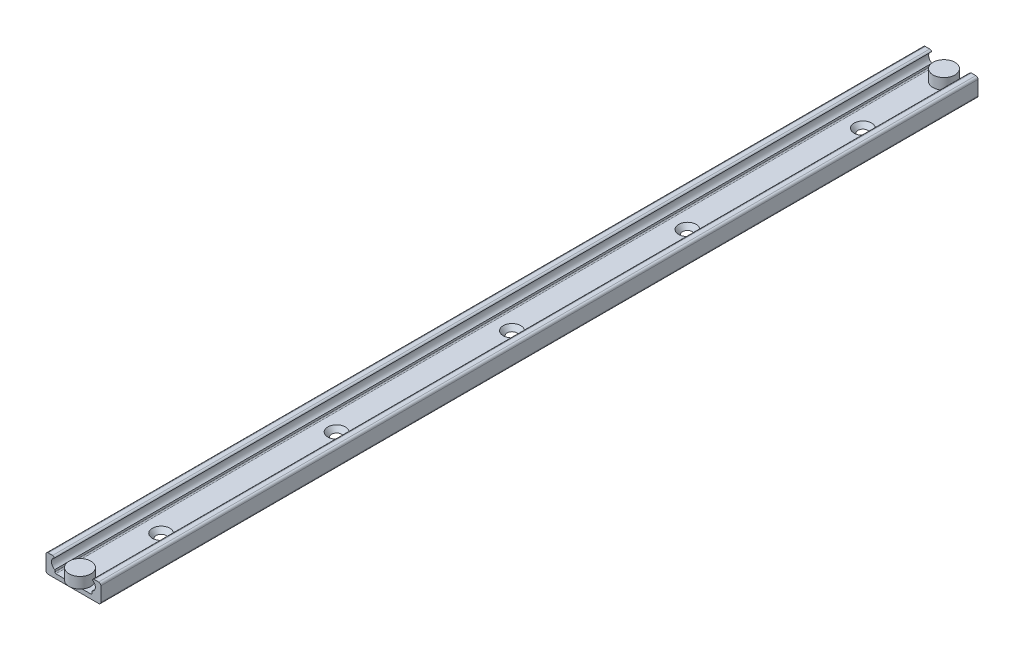
ISO-10303-21;
HEADER;
FILE_DESCRIPTION(('STEP AP214'),'2;1');
FILE_NAME('part.step','',(''),(''),'','','');
FILE_SCHEMA(('AUTOMOTIVE_DESIGN { 1 0 10303 214 1 1 1 1 }'));
ENDSEC;
DATA;
#1=APPLICATION_CONTEXT('core data for automotive mechanical design processes');
#2=APPLICATION_PROTOCOL_DEFINITION('international standard','automotive_design',2000,#1);
#3=PRODUCT_CONTEXT('',#1,'mechanical');
#4=PRODUCT('Part','Part','',(#3));
#5=PRODUCT_RELATED_PRODUCT_CATEGORY('part','',(#4));
#6=PRODUCT_DEFINITION_FORMATION('','',#4);
#7=PRODUCT_DEFINITION_CONTEXT('part definition',#1,'design');
#8=PRODUCT_DEFINITION('design','',#6,#7);
#9=PRODUCT_DEFINITION_SHAPE('','',#8);
#10=(LENGTH_UNIT() NAMED_UNIT(*) SI_UNIT(.MILLI.,.METRE.));
#11=(NAMED_UNIT(*) PLANE_ANGLE_UNIT() SI_UNIT($,.RADIAN.));
#12=(NAMED_UNIT(*) SI_UNIT($,.STERADIAN.) SOLID_ANGLE_UNIT());
#13=UNCERTAINTY_MEASURE_WITH_UNIT(LENGTH_MEASURE(1.E-05),#10,'distance_accuracy_value','');
#14=(GEOMETRIC_REPRESENTATION_CONTEXT(3) GLOBAL_UNCERTAINTY_ASSIGNED_CONTEXT((#13)) GLOBAL_UNIT_ASSIGNED_CONTEXT((#10,
#11,#12)) REPRESENTATION_CONTEXT('',''));
#15=CARTESIAN_POINT('',(0.,0.,0.));
#16=DIRECTION('',(0.,0.,1.));
#17=DIRECTION('',(1.,0.,0.));
#18=AXIS2_PLACEMENT_3D('',#15,#16,#17);
#19=CARTESIAN_POINT('',(-11.5000000000008,0.999999999999226,400.));
#20=DIRECTION('',(0.,0.,-1.));
#21=DIRECTION('',(-1.,0.,0.));
#22=AXIS2_PLACEMENT_3D('',#19,#20,#21);
#23=CYLINDRICAL_SURFACE('',#22,0.999999999999226);
#24=CARTESIAN_POINT('',(-11.5000000000008,0.999999999999226,0.));
#25=DIRECTION('',(0.,0.,1.));
#26=DIRECTION('',(1.,0.,0.));
#27=AXIS2_PLACEMENT_3D('',#24,#25,#26);
#28=CIRCLE('',#27,0.999999999999226);
#29=CARTESIAN_POINT('',(-12.5,1.,0.));
#30=VERTEX_POINT('',#29);
#31=CARTESIAN_POINT('',(-11.5,0.,0.));
#32=VERTEX_POINT('',#31);
#33=EDGE_CURVE('E220',#30,#32,#28,.T.);
#34=ORIENTED_EDGE('',*,*,#33,.T.);
#35=DIRECTION('',(0.,0.,-1.));
#36=VECTOR('',#35,1.);
#37=CARTESIAN_POINT('',(-11.5,0.,400.));
#38=LINE('',#37,#36);
#39=CARTESIAN_POINT('',(-11.5,0.,400.));
#40=VERTEX_POINT('',#39);
#41=EDGE_CURVE('E11',#40,#32,#38,.T.);
#42=ORIENTED_EDGE('',*,*,#41,.F.);
#43=CARTESIAN_POINT('',(-11.5000000000008,0.999999999999226,400.));
#44=DIRECTION('',(0.,0.,1.));
#45=DIRECTION('',(1.,0.,0.));
#46=AXIS2_PLACEMENT_3D('',#43,#44,#45);
#47=CIRCLE('',#46,0.999999999999226);
#48=CARTESIAN_POINT('',(-12.5,1.,400.));
#49=VERTEX_POINT('',#48);
#50=EDGE_CURVE('E214',#49,#40,#47,.T.);
#51=ORIENTED_EDGE('',*,*,#50,.F.);
#52=DIRECTION('',(0.,0.,-1.));
#53=VECTOR('',#52,1.);
#54=CARTESIAN_POINT('',(-12.5,1.,400.));
#55=LINE('',#54,#53);
#56=EDGE_CURVE('E285',#49,#30,#55,.T.);
#57=ORIENTED_EDGE('',*,*,#56,.T.);
#58=EDGE_LOOP('',(#34,#42,#51,#57));
#59=FACE_BOUND('',#58,.T.);
#60=ADVANCED_FACE('F33',(#59),#23,.T.);
#61=CARTESIAN_POINT('',(-11.5,0.,400.));
#62=DIRECTION('',(0.,1.,0.));
#63=DIRECTION('',(0.,0.,1.));
#64=AXIS2_PLACEMENT_3D('',#61,#62,#63);
#65=PLANE('',#64);
#66=CARTESIAN_POINT('',(0.,0.,360.));
#67=DIRECTION('',(0.,1.,0.));
#68=DIRECTION('',(0.,0.,1.));
#69=AXIS2_PLACEMENT_3D('',#66,#67,#68);
#70=CIRCLE('',#69,2.25);
#71=CARTESIAN_POINT('',(0.,0.,362.25));
#72=VERTEX_POINT('',#71);
#73=EDGE_CURVE('E245',#72,#72,#70,.T.);
#74=ORIENTED_EDGE('',*,*,#73,.T.);
#75=EDGE_LOOP('',(#74));
#76=FACE_BOUND('',#75,.T.);
#77=CARTESIAN_POINT('',(0.,0.,280.));
#78=DIRECTION('',(0.,1.,0.));
#79=DIRECTION('',(0.,0.,1.));
#80=AXIS2_PLACEMENT_3D('',#77,#78,#79);
#81=CIRCLE('',#80,2.25);
#82=CARTESIAN_POINT('',(0.,0.,282.25));
#83=VERTEX_POINT('',#82);
#84=EDGE_CURVE('E239',#83,#83,#81,.T.);
#85=ORIENTED_EDGE('',*,*,#84,.T.);
#86=EDGE_LOOP('',(#85));
#87=FACE_BOUND('',#86,.T.);
#88=CARTESIAN_POINT('',(0.,0.,200.));
#89=DIRECTION('',(0.,1.,0.));
#90=DIRECTION('',(0.,0.,1.));
#91=AXIS2_PLACEMENT_3D('',#88,#89,#90);
#92=CIRCLE('',#91,2.25);
#93=CARTESIAN_POINT('',(0.,0.,202.25));
#94=VERTEX_POINT('',#93);
#95=EDGE_CURVE('E233',#94,#94,#92,.T.);
#96=ORIENTED_EDGE('',*,*,#95,.T.);
#97=EDGE_LOOP('',(#96));
#98=FACE_BOUND('',#97,.T.);
#99=CARTESIAN_POINT('',(0.,0.,120.));
#100=DIRECTION('',(0.,1.,0.));
#101=DIRECTION('',(0.,0.,1.));
#102=AXIS2_PLACEMENT_3D('',#99,#100,#101);
#103=CIRCLE('',#102,2.25);
#104=CARTESIAN_POINT('',(0.,0.,122.25));
#105=VERTEX_POINT('',#104);
#106=EDGE_CURVE('E227',#105,#105,#103,.T.);
#107=ORIENTED_EDGE('',*,*,#106,.T.);
#108=EDGE_LOOP('',(#107));
#109=FACE_BOUND('',#108,.T.);
#110=CARTESIAN_POINT('',(0.,0.,40.));
#111=DIRECTION('',(0.,1.,0.));
#112=DIRECTION('',(0.,0.,1.));
#113=AXIS2_PLACEMENT_3D('',#110,#111,#112);
#114=CIRCLE('',#113,2.25);
#115=CARTESIAN_POINT('',(0.,0.,42.25));
#116=VERTEX_POINT('',#115);
#117=EDGE_CURVE('E221',#116,#116,#114,.T.);
#118=ORIENTED_EDGE('',*,*,#117,.T.);
#119=EDGE_LOOP('',(#118));
#120=FACE_BOUND('',#119,.T.);
#121=DIRECTION('',(1.,0.,0.));
#122=VECTOR('',#121,1.);
#123=CARTESIAN_POINT('',(-11.5,0.,0.));
#124=LINE('',#123,#122);
#125=CARTESIAN_POINT('',(11.5,0.,0.));
#126=VERTEX_POINT('',#125);
#127=EDGE_CURVE('E344',#32,#126,#124,.T.);
#128=ORIENTED_EDGE('',*,*,#127,.T.);
#129=DIRECTION('',(0.,0.,-1.));
#130=VECTOR('',#129,1.);
#131=CARTESIAN_POINT('',(11.5,0.,400.));
#132=LINE('',#131,#130);
#133=CARTESIAN_POINT('',(11.5,0.,400.));
#134=VERTEX_POINT('',#133);
#135=EDGE_CURVE('E40',#134,#126,#132,.T.);
#136=ORIENTED_EDGE('',*,*,#135,.F.);
#137=DIRECTION('',(1.,0.,0.));
#138=VECTOR('',#137,1.);
#139=CARTESIAN_POINT('',(-11.5,0.,400.));
#140=LINE('',#139,#138);
#141=EDGE_CURVE('E212',#40,#134,#140,.T.);
#142=ORIENTED_EDGE('',*,*,#141,.F.);
#143=ORIENTED_EDGE('',*,*,#41,.T.);
#144=EDGE_LOOP('',(#128,#136,#142,#143));
#145=FACE_BOUND('',#144,.T.);
#146=ADVANCED_FACE('F393',(#76,#87,#98,#109,#120,#145),#65,.F.);
#147=CARTESIAN_POINT('',(11.5000000000008,0.999999999999226,400.));
#148=DIRECTION('',(0.,0.,-1.));
#149=DIRECTION('',(-1.,0.,0.));
#150=AXIS2_PLACEMENT_3D('',#147,#148,#149);
#151=CYLINDRICAL_SURFACE('',#150,0.999999999999226);
#152=CARTESIAN_POINT('',(11.5000000000008,0.999999999999226,0.));
#153=DIRECTION('',(0.,0.,1.));
#154=DIRECTION('',(1.,0.,0.));
#155=AXIS2_PLACEMENT_3D('',#152,#153,#154);
#156=CIRCLE('',#155,0.999999999999226);
#157=CARTESIAN_POINT('',(12.5,1.,0.));
#158=VERTEX_POINT('',#157);
#159=EDGE_CURVE('E339',#126,#158,#156,.T.);
#160=ORIENTED_EDGE('',*,*,#159,.T.);
#161=DIRECTION('',(0.,0.,-1.));
#162=VECTOR('',#161,1.);
#163=CARTESIAN_POINT('',(12.5,1.,400.));
#164=LINE('',#163,#162);
#165=CARTESIAN_POINT('',(12.5,1.,400.));
#166=VERTEX_POINT('',#165);
#167=EDGE_CURVE('E330',#166,#158,#164,.T.);
#168=ORIENTED_EDGE('',*,*,#167,.F.);
#169=CARTESIAN_POINT('',(11.5000000000008,0.999999999999226,400.));
#170=DIRECTION('',(0.,0.,1.));
#171=DIRECTION('',(1.,0.,0.));
#172=AXIS2_PLACEMENT_3D('',#169,#170,#171);
#173=CIRCLE('',#172,0.999999999999226);
#174=EDGE_CURVE('E210',#134,#166,#173,.T.);
#175=ORIENTED_EDGE('',*,*,#174,.F.);
#176=ORIENTED_EDGE('',*,*,#135,.T.);
#177=EDGE_LOOP('',(#160,#168,#175,#176));
#178=FACE_BOUND('',#177,.T.);
#179=ADVANCED_FACE('F337',(#178),#151,.T.);
#180=CARTESIAN_POINT('',(12.5,1.,400.));
#181=DIRECTION('',(-1.,0.,0.));
#182=DIRECTION('',(0.,0.,1.));
#183=AXIS2_PLACEMENT_3D('',#180,#181,#182);
#184=PLANE('',#183);
#185=DIRECTION('',(0.,1.,0.));
#186=VECTOR('',#185,1.);
#187=CARTESIAN_POINT('',(12.5,1.,0.));
#188=LINE('',#187,#186);
#189=CARTESIAN_POINT('',(12.5,7.5,0.));
#190=VERTEX_POINT('',#189);
#191=EDGE_CURVE('E346',#158,#190,#188,.T.);
#192=ORIENTED_EDGE('',*,*,#191,.T.);
#193=DIRECTION('',(0.,0.,-1.));
#194=VECTOR('',#193,1.);
#195=CARTESIAN_POINT('',(12.5,7.5,400.));
#196=LINE('',#195,#194);
#197=CARTESIAN_POINT('',(12.5,7.5,400.));
#198=VERTEX_POINT('',#197);
#199=EDGE_CURVE('E327',#198,#190,#196,.T.);
#200=ORIENTED_EDGE('',*,*,#199,.F.);
#201=DIRECTION('',(0.,1.,0.));
#202=VECTOR('',#201,1.);
#203=CARTESIAN_POINT('',(12.5,1.,400.));
#204=LINE('',#203,#202);
#205=EDGE_CURVE('E208',#166,#198,#204,.T.);
#206=ORIENTED_EDGE('',*,*,#205,.F.);
#207=ORIENTED_EDGE('',*,*,#167,.T.);
#208=EDGE_LOOP('',(#192,#200,#206,#207));
#209=FACE_BOUND('',#208,.T.);
#210=ADVANCED_FACE('F390',(#209),#184,.F.);
#211=CARTESIAN_POINT('',(11.5000000000007,7.50000000000069,400.));
#212=DIRECTION('',(0.,0.,-1.));
#213=DIRECTION('',(-1.,0.,0.));
#214=AXIS2_PLACEMENT_3D('',#211,#212,#213);
#215=CYLINDRICAL_SURFACE('',#214,0.999999999999313);
#216=CARTESIAN_POINT('',(11.5000000000007,7.50000000000069,0.));
#217=DIRECTION('',(0.,0.,1.));
#218=DIRECTION('',(1.,0.,0.));
#219=AXIS2_PLACEMENT_3D('',#216,#217,#218);
#220=CIRCLE('',#219,0.999999999999313);
#221=CARTESIAN_POINT('',(11.5,8.5,0.));
#222=VERTEX_POINT('',#221);
#223=EDGE_CURVE('E348',#190,#222,#220,.T.);
#224=ORIENTED_EDGE('',*,*,#223,.T.);
#225=DIRECTION('',(0.,0.,-1.));
#226=VECTOR('',#225,1.);
#227=CARTESIAN_POINT('',(11.5,8.5,400.));
#228=LINE('',#227,#226);
#229=CARTESIAN_POINT('',(11.5,8.5,400.));
#230=VERTEX_POINT('',#229);
#231=EDGE_CURVE('E324',#230,#222,#228,.T.);
#232=ORIENTED_EDGE('',*,*,#231,.F.);
#233=CARTESIAN_POINT('',(11.5000000000007,7.50000000000069,400.));
#234=DIRECTION('',(0.,0.,1.));
#235=DIRECTION('',(1.,0.,0.));
#236=AXIS2_PLACEMENT_3D('',#233,#234,#235);
#237=CIRCLE('',#236,0.999999999999313);
#238=EDGE_CURVE('E206',#198,#230,#237,.T.);
#239=ORIENTED_EDGE('',*,*,#238,.F.);
#240=ORIENTED_EDGE('',*,*,#199,.T.);
#241=EDGE_LOOP('',(#224,#232,#239,#240));
#242=FACE_BOUND('',#241,.T.);
#243=ADVANCED_FACE('F385',(#242),#215,.T.);
#244=CARTESIAN_POINT('',(11.5,8.5,400.));
#245=DIRECTION('',(0.,-1.,0.));
#246=DIRECTION('',(0.,0.,-1.));
#247=AXIS2_PLACEMENT_3D('',#244,#245,#246);
#248=PLANE('',#247);
#249=DIRECTION('',(-1.,0.,0.));
#250=VECTOR('',#249,1.);
#251=CARTESIAN_POINT('',(11.5,8.5,0.));
#252=LINE('',#251,#250);
#253=CARTESIAN_POINT('',(9.5,8.5,0.));
#254=VERTEX_POINT('',#253);
#255=EDGE_CURVE('E354',#222,#254,#252,.T.);
#256=ORIENTED_EDGE('',*,*,#255,.T.);
#257=DIRECTION('',(0.,0.,-1.));
#258=VECTOR('',#257,1.);
#259=CARTESIAN_POINT('',(9.5,8.5,400.));
#260=LINE('',#259,#258);
#261=CARTESIAN_POINT('',(9.5,8.5,400.));
#262=VERTEX_POINT('',#261);
#263=EDGE_CURVE('E321',#262,#254,#260,.T.);
#264=ORIENTED_EDGE('',*,*,#263,.F.);
#265=DIRECTION('',(-1.,0.,0.));
#266=VECTOR('',#265,1.);
#267=CARTESIAN_POINT('',(11.5,8.5,400.));
#268=LINE('',#267,#266);
#269=EDGE_CURVE('E204',#230,#262,#268,.T.);
#270=ORIENTED_EDGE('',*,*,#269,.F.);
#271=ORIENTED_EDGE('',*,*,#231,.T.);
#272=EDGE_LOOP('',(#256,#264,#270,#271));
#273=FACE_BOUND('',#272,.T.);
#274=ADVANCED_FACE('F382',(#273),#248,.F.);
#275=CARTESIAN_POINT('',(9.50000000000007,7.49999999999999,400.));
#276=DIRECTION('',(0.,0.,-1.));
#277=DIRECTION('',(-1.,0.,0.));
#278=AXIS2_PLACEMENT_3D('',#275,#276,#277);
#279=CYLINDRICAL_SURFACE('',#278,1.00000000000001);
#280=CARTESIAN_POINT('',(9.50000000000007,7.49999999999999,0.));
#281=DIRECTION('',(0.,0.,1.));
#282=DIRECTION('',(1.,0.,0.));
#283=AXIS2_PLACEMENT_3D('',#280,#281,#282);
#284=CIRCLE('',#283,1.00000000000001);
#285=CARTESIAN_POINT('',(8.6035924033162,7.943230662982,0.));
#286=VERTEX_POINT('',#285);
#287=EDGE_CURVE('E356',#254,#286,#284,.T.);
#288=ORIENTED_EDGE('',*,*,#287,.T.);
#289=DIRECTION('',(0.,0.,-1.));
#290=VECTOR('',#289,1.);
#291=CARTESIAN_POINT('',(8.6035924033162,7.943230662982,400.));
#292=LINE('',#291,#290);
#293=CARTESIAN_POINT('',(8.6035924033162,7.943230662982,400.));
#294=VERTEX_POINT('',#293);
#295=EDGE_CURVE('E318',#294,#286,#292,.T.);
#296=ORIENTED_EDGE('',*,*,#295,.F.);
#297=CARTESIAN_POINT('',(9.50000000000007,7.49999999999999,400.));
#298=DIRECTION('',(0.,0.,1.));
#299=DIRECTION('',(1.,0.,0.));
#300=AXIS2_PLACEMENT_3D('',#297,#298,#299);
#301=CIRCLE('',#300,1.00000000000001);
#302=EDGE_CURVE('E202',#262,#294,#301,.T.);
#303=ORIENTED_EDGE('',*,*,#302,.F.);
#304=ORIENTED_EDGE('',*,*,#263,.T.);
#305=EDGE_LOOP('',(#288,#296,#303,#304));
#306=FACE_BOUND('',#305,.T.);
#307=ADVANCED_FACE('F380',(#306),#279,.T.);
#308=CARTESIAN_POINT('',(7.49999999999998,5.7,400.));
#309=DIRECTION('',(0.,0.,-1.));
#310=DIRECTION('',(-1.,0.,0.));
#311=AXIS2_PLACEMENT_3D('',#308,#309,#310);
#312=CYLINDRICAL_SURFACE('',#311,2.49999999999999);
#313=CARTESIAN_POINT('',(7.49999999999998,5.7,0.));
#314=DIRECTION('',(0.,0.,-1.));
#315=DIRECTION('',(-1.,0.,0.));
#316=AXIS2_PLACEMENT_3D('',#313,#314,#315);
#317=CIRCLE('',#316,2.49999999999999);
#318=CARTESIAN_POINT('',(8.5,3.4087121525221,0.));
#319=VERTEX_POINT('',#318);
#320=EDGE_CURVE('E358',#286,#319,#317,.T.);
#321=ORIENTED_EDGE('',*,*,#320,.T.);
#322=DIRECTION('',(0.,0.,-1.));
#323=VECTOR('',#322,1.);
#324=CARTESIAN_POINT('',(8.5,3.4087121525221,400.));
#325=LINE('',#324,#323);
#326=CARTESIAN_POINT('',(8.5,3.4087121525221,400.));
#327=VERTEX_POINT('',#326);
#328=EDGE_CURVE('E315',#327,#319,#325,.T.);
#329=ORIENTED_EDGE('',*,*,#328,.F.);
#330=CARTESIAN_POINT('',(7.49999999999998,5.7,400.));
#331=DIRECTION('',(0.,0.,-1.));
#332=DIRECTION('',(-1.,0.,0.));
#333=AXIS2_PLACEMENT_3D('',#330,#331,#332);
#334=CIRCLE('',#333,2.49999999999999);
#335=EDGE_CURVE('E198',#294,#327,#334,.T.);
#336=ORIENTED_EDGE('',*,*,#335,.F.);
#337=ORIENTED_EDGE('',*,*,#295,.T.);
#338=EDGE_LOOP('',(#321,#329,#336,#337));
#339=FACE_BOUND('',#338,.T.);
#340=ADVANCED_FACE('F371',(#339),#312,.F.);
#341=CARTESIAN_POINT('',(8.5,3.4087121525221,400.));
#342=DIRECTION('',(1.,0.,0.));
#343=DIRECTION('',(0.,0.,-1.));
#344=AXIS2_PLACEMENT_3D('',#341,#342,#343);
#345=PLANE('',#344);
#346=DIRECTION('',(0.,-1.,0.));
#347=VECTOR('',#346,1.);
#348=CARTESIAN_POINT('',(8.5,3.4087121525221,0.));
#349=LINE('',#348,#347);
#350=CARTESIAN_POINT('',(8.5,2.5,0.));
#351=VERTEX_POINT('',#350);
#352=EDGE_CURVE('E359',#319,#351,#349,.T.);
#353=ORIENTED_EDGE('',*,*,#352,.T.);
#354=DIRECTION('',(0.,0.,-1.));
#355=VECTOR('',#354,1.);
#356=CARTESIAN_POINT('',(8.5,2.5,400.));
#357=LINE('',#356,#355);
#358=CARTESIAN_POINT('',(8.5,2.5,400.));
#359=VERTEX_POINT('',#358);
#360=EDGE_CURVE('E312',#359,#351,#357,.T.);
#361=ORIENTED_EDGE('',*,*,#360,.F.);
#362=DIRECTION('',(0.,-1.,0.));
#363=VECTOR('',#362,1.);
#364=CARTESIAN_POINT('',(8.5,3.4087121525221,400.));
#365=LINE('',#364,#363);
#366=EDGE_CURVE('E197',#327,#359,#365,.T.);
#367=ORIENTED_EDGE('',*,*,#366,.F.);
#368=ORIENTED_EDGE('',*,*,#328,.T.);
#369=EDGE_LOOP('',(#353,#361,#367,#368));
#370=FACE_BOUND('',#369,.T.);
#371=ADVANCED_FACE('F375',(#370),#345,.F.);
#372=CARTESIAN_POINT('',(8.00000000000009,2.49999999999991,400.));
#373=DIRECTION('',(0.,0.,-1.));
#374=DIRECTION('',(-1.,0.,0.));
#375=AXIS2_PLACEMENT_3D('',#372,#373,#374);
#376=CYLINDRICAL_SURFACE('',#375,0.49999999999991);
#377=CARTESIAN_POINT('',(8.00000000000009,2.49999999999991,0.));
#378=DIRECTION('',(0.,0.,-1.));
#379=DIRECTION('',(-1.,0.,0.));
#380=AXIS2_PLACEMENT_3D('',#377,#378,#379);
#381=CIRCLE('',#380,0.49999999999991);
#382=CARTESIAN_POINT('',(8.,2.,0.));
#383=VERTEX_POINT('',#382);
#384=EDGE_CURVE('E269',#351,#383,#381,.T.);
#385=ORIENTED_EDGE('',*,*,#384,.T.);
#386=DIRECTION('',(0.,0.,-1.));
#387=VECTOR('',#386,1.);
#388=CARTESIAN_POINT('',(8.,2.,400.));
#389=LINE('',#388,#387);
#390=CARTESIAN_POINT('',(8.,2.,400.));
#391=VERTEX_POINT('',#390);
#392=EDGE_CURVE('E310',#391,#383,#389,.T.);
#393=ORIENTED_EDGE('',*,*,#392,.F.);
#394=CARTESIAN_POINT('',(8.00000000000009,2.49999999999991,400.));
#395=DIRECTION('',(0.,0.,-1.));
#396=DIRECTION('',(-1.,0.,0.));
#397=AXIS2_PLACEMENT_3D('',#394,#395,#396);
#398=CIRCLE('',#397,0.49999999999991);
#399=EDGE_CURVE('E191',#359,#391,#398,.T.);
#400=ORIENTED_EDGE('',*,*,#399,.F.);
#401=ORIENTED_EDGE('',*,*,#360,.T.);
#402=EDGE_LOOP('',(#385,#393,#400,#401));
#403=FACE_BOUND('',#402,.T.);
#404=ADVANCED_FACE('F365',(#403),#376,.F.);
#405=CARTESIAN_POINT('',(8.,2.,400.));
#406=DIRECTION('',(0.,-1.,0.));
#407=DIRECTION('',(0.,0.,-1.));
#408=AXIS2_PLACEMENT_3D('',#405,#406,#407);
#409=PLANE('',#408);
#410=CARTESIAN_POINT('',(0.,2.,397.));
#411=DIRECTION('',(0.,1.,0.));
#412=DIRECTION('',(0.,0.,1.));
#413=AXIS2_PLACEMENT_3D('',#410,#411,#412);
#414=CIRCLE('',#413,5.);
#415=CARTESIAN_POINT('',(4.,2.,400.));
#416=VERTEX_POINT('',#415);
#417=CARTESIAN_POINT('',(-4.,2.,400.));
#418=VERTEX_POINT('',#417);
#419=EDGE_CURVE('E46',#416,#418,#414,.T.);
#420=ORIENTED_EDGE('',*,*,#419,.F.);
#421=DIRECTION('',(-1.,0.,0.));
#422=VECTOR('',#421,1.);
#423=CARTESIAN_POINT('',(8.,2.,400.));
#424=LINE('',#423,#422);
#425=EDGE_CURVE('E176',#391,#416,#424,.T.);
#426=ORIENTED_EDGE('',*,*,#425,.F.);
#427=ORIENTED_EDGE('',*,*,#392,.T.);
#428=DIRECTION('',(-1.,0.,0.));
#429=VECTOR('',#428,1.);
#430=CARTESIAN_POINT('',(8.,2.,0.));
#431=LINE('',#430,#429);
#432=CARTESIAN_POINT('',(4.,2.,0.));
#433=VERTEX_POINT('',#432);
#434=EDGE_CURVE('E265',#383,#433,#431,.T.);
#435=ORIENTED_EDGE('',*,*,#434,.T.);
#436=CARTESIAN_POINT('',(0.,2.,3.));
#437=DIRECTION('',(0.,1.,0.));
#438=DIRECTION('',(0.,0.,1.));
#439=AXIS2_PLACEMENT_3D('',#436,#437,#438);
#440=CIRCLE('',#439,5.);
#441=CARTESIAN_POINT('',(-4.,2.,0.));
#442=VERTEX_POINT('',#441);
#443=EDGE_CURVE('E252',#442,#433,#440,.T.);
#444=ORIENTED_EDGE('',*,*,#443,.F.);
#445=CARTESIAN_POINT('',(-8.,2.,0.));
#446=VERTEX_POINT('',#445);
#447=EDGE_CURVE('E266',#442,#446,#431,.T.);
#448=ORIENTED_EDGE('',*,*,#447,.T.);
#449=DIRECTION('',(0.,0.,-1.));
#450=VECTOR('',#449,1.);
#451=CARTESIAN_POINT('',(-8.,2.,400.));
#452=LINE('',#451,#450);
#453=CARTESIAN_POINT('',(-8.,2.,400.));
#454=VERTEX_POINT('',#453);
#455=EDGE_CURVE('E307',#454,#446,#452,.T.);
#456=ORIENTED_EDGE('',*,*,#455,.F.);
#457=EDGE_CURVE('E177',#418,#454,#424,.T.);
#458=ORIENTED_EDGE('',*,*,#457,.F.);
#459=EDGE_LOOP('',(#420,#426,#427,#435,#444,#448,#456,#458));
#460=FACE_BOUND('',#459,.T.);
#461=CARTESIAN_POINT('',(0.,2.,360.));
#462=DIRECTION('',(0.,1.,0.));
#463=DIRECTION('',(0.,0.,1.));
#464=AXIS2_PLACEMENT_3D('',#461,#462,#463);
#465=CIRCLE('',#464,4.);
#466=CARTESIAN_POINT('',(0.,2.,364.));
#467=VERTEX_POINT('',#466);
#468=EDGE_CURVE('E242',#467,#467,#465,.T.);
#469=ORIENTED_EDGE('',*,*,#468,.F.);
#470=EDGE_LOOP('',(#469));
#471=FACE_BOUND('',#470,.T.);
#472=CARTESIAN_POINT('',(0.,2.,280.));
#473=DIRECTION('',(0.,1.,0.));
#474=DIRECTION('',(0.,0.,1.));
#475=AXIS2_PLACEMENT_3D('',#472,#473,#474);
#476=CIRCLE('',#475,4.);
#477=CARTESIAN_POINT('',(0.,2.,284.));
#478=VERTEX_POINT('',#477);
#479=EDGE_CURVE('E236',#478,#478,#476,.T.);
#480=ORIENTED_EDGE('',*,*,#479,.F.);
#481=EDGE_LOOP('',(#480));
#482=FACE_BOUND('',#481,.T.);
#483=CARTESIAN_POINT('',(0.,2.,200.));
#484=DIRECTION('',(0.,1.,0.));
#485=DIRECTION('',(0.,0.,1.));
#486=AXIS2_PLACEMENT_3D('',#483,#484,#485);
#487=CIRCLE('',#486,4.);
#488=CARTESIAN_POINT('',(0.,2.,204.));
#489=VERTEX_POINT('',#488);
#490=EDGE_CURVE('E230',#489,#489,#487,.T.);
#491=ORIENTED_EDGE('',*,*,#490,.F.);
#492=EDGE_LOOP('',(#491));
#493=FACE_BOUND('',#492,.T.);
#494=CARTESIAN_POINT('',(0.,2.,120.));
#495=DIRECTION('',(0.,1.,0.));
#496=DIRECTION('',(0.,0.,1.));
#497=AXIS2_PLACEMENT_3D('',#494,#495,#496);
#498=CIRCLE('',#497,4.);
#499=CARTESIAN_POINT('',(0.,2.,124.));
#500=VERTEX_POINT('',#499);
#501=EDGE_CURVE('E224',#500,#500,#498,.T.);
#502=ORIENTED_EDGE('',*,*,#501,.F.);
#503=EDGE_LOOP('',(#502));
#504=FACE_BOUND('',#503,.T.);
#505=CARTESIAN_POINT('',(0.,2.,40.));
#506=DIRECTION('',(0.,1.,0.));
#507=DIRECTION('',(0.,0.,1.));
#508=AXIS2_PLACEMENT_3D('',#505,#506,#507);
#509=CIRCLE('',#508,4.);
#510=CARTESIAN_POINT('',(0.,2.,44.));
#511=VERTEX_POINT('',#510);
#512=EDGE_CURVE('E217',#511,#511,#509,.T.);
#513=ORIENTED_EDGE('',*,*,#512,.F.);
#514=EDGE_LOOP('',(#513));
#515=FACE_BOUND('',#514,.T.);
#516=ADVANCED_FACE('F183',(#460,#471,#482,#493,#504,#515),#409,.F.);
#517=CARTESIAN_POINT('',(-8.00000000000009,2.49999999999991,400.));
#518=DIRECTION('',(0.,0.,-1.));
#519=DIRECTION('',(-1.,0.,0.));
#520=AXIS2_PLACEMENT_3D('',#517,#518,#519);
#521=CYLINDRICAL_SURFACE('',#520,0.49999999999991);
#522=CARTESIAN_POINT('',(-8.00000000000009,2.49999999999991,0.));
#523=DIRECTION('',(0.,0.,-1.));
#524=DIRECTION('',(-1.,0.,0.));
#525=AXIS2_PLACEMENT_3D('',#522,#523,#524);
#526=CIRCLE('',#525,0.49999999999991);
#527=CARTESIAN_POINT('',(-8.5,2.5,0.));
#528=VERTEX_POINT('',#527);
#529=EDGE_CURVE('E268',#446,#528,#526,.T.);
#530=ORIENTED_EDGE('',*,*,#529,.T.);
#531=DIRECTION('',(0.,0.,-1.));
#532=VECTOR('',#531,1.);
#533=CARTESIAN_POINT('',(-8.5,2.5,400.));
#534=LINE('',#533,#532);
#535=CARTESIAN_POINT('',(-8.5,2.5,400.));
#536=VERTEX_POINT('',#535);
#537=EDGE_CURVE('E304',#536,#528,#534,.T.);
#538=ORIENTED_EDGE('',*,*,#537,.F.);
#539=CARTESIAN_POINT('',(-8.00000000000009,2.49999999999991,400.));
#540=DIRECTION('',(0.,0.,-1.));
#541=DIRECTION('',(-1.,0.,0.));
#542=AXIS2_PLACEMENT_3D('',#539,#540,#541);
#543=CIRCLE('',#542,0.49999999999991);
#544=EDGE_CURVE('E193',#454,#536,#543,.T.);
#545=ORIENTED_EDGE('',*,*,#544,.F.);
#546=ORIENTED_EDGE('',*,*,#455,.T.);
#547=EDGE_LOOP('',(#530,#538,#545,#546));
#548=FACE_BOUND('',#547,.T.);
#549=ADVANCED_FACE('F440',(#548),#521,.F.);
#550=CARTESIAN_POINT('',(-8.5,2.5,400.));
#551=DIRECTION('',(-1.,0.,0.));
#552=DIRECTION('',(0.,0.,1.));
#553=AXIS2_PLACEMENT_3D('',#550,#551,#552);
#554=PLANE('',#553);
#555=DIRECTION('',(0.,1.,0.));
#556=VECTOR('',#555,1.);
#557=CARTESIAN_POINT('',(-8.5,2.5,0.));
#558=LINE('',#557,#556);
#559=CARTESIAN_POINT('',(-8.5,3.4087121525221,0.));
#560=VERTEX_POINT('',#559);
#561=EDGE_CURVE('E274',#528,#560,#558,.T.);
#562=ORIENTED_EDGE('',*,*,#561,.T.);
#563=DIRECTION('',(0.,0.,-1.));
#564=VECTOR('',#563,1.);
#565=CARTESIAN_POINT('',(-8.5,3.4087121525221,400.));
#566=LINE('',#565,#564);
#567=CARTESIAN_POINT('',(-8.5,3.4087121525221,400.));
#568=VERTEX_POINT('',#567);
#569=EDGE_CURVE('E301',#568,#560,#566,.T.);
#570=ORIENTED_EDGE('',*,*,#569,.F.);
#571=DIRECTION('',(0.,1.,0.));
#572=VECTOR('',#571,1.);
#573=CARTESIAN_POINT('',(-8.5,2.5,400.));
#574=LINE('',#573,#572);
#575=EDGE_CURVE('E194',#536,#568,#574,.T.);
#576=ORIENTED_EDGE('',*,*,#575,.F.);
#577=ORIENTED_EDGE('',*,*,#537,.T.);
#578=EDGE_LOOP('',(#562,#570,#576,#577));
#579=FACE_BOUND('',#578,.T.);
#580=ADVANCED_FACE('F415',(#579),#554,.F.);
#581=CARTESIAN_POINT('',(-7.49999999999998,5.7,400.));
#582=DIRECTION('',(0.,0.,-1.));
#583=DIRECTION('',(-1.,0.,0.));
#584=AXIS2_PLACEMENT_3D('',#581,#582,#583);
#585=CYLINDRICAL_SURFACE('',#584,2.49999999999999);
#586=CARTESIAN_POINT('',(-7.49999999999998,5.7,0.));
#587=DIRECTION('',(0.,0.,-1.));
#588=DIRECTION('',(-1.,0.,0.));
#589=AXIS2_PLACEMENT_3D('',#586,#587,#588);
#590=CIRCLE('',#589,2.49999999999999);
#591=CARTESIAN_POINT('',(-8.6035924033162,7.943230662982,0.));
#592=VERTEX_POINT('',#591);
#593=EDGE_CURVE('E276',#560,#592,#590,.T.);
#594=ORIENTED_EDGE('',*,*,#593,.T.);
#595=DIRECTION('',(0.,0.,-1.));
#596=VECTOR('',#595,1.);
#597=CARTESIAN_POINT('',(-8.6035924033162,7.943230662982,400.));
#598=LINE('',#597,#596);
#599=CARTESIAN_POINT('',(-8.6035924033162,7.943230662982,400.));
#600=VERTEX_POINT('',#599);
#601=EDGE_CURVE('E298',#600,#592,#598,.T.);
#602=ORIENTED_EDGE('',*,*,#601,.F.);
#603=CARTESIAN_POINT('',(-7.49999999999998,5.7,400.));
#604=DIRECTION('',(0.,0.,-1.));
#605=DIRECTION('',(-1.,0.,0.));
#606=AXIS2_PLACEMENT_3D('',#603,#604,#605);
#607=CIRCLE('',#606,2.49999999999999);
#608=EDGE_CURVE('E406',#568,#600,#607,.T.);
#609=ORIENTED_EDGE('',*,*,#608,.F.);
#610=ORIENTED_EDGE('',*,*,#569,.T.);
#611=EDGE_LOOP('',(#594,#602,#609,#610));
#612=FACE_BOUND('',#611,.T.);
#613=ADVANCED_FACE('F419',(#612),#585,.F.);
#614=CARTESIAN_POINT('',(-9.50000000000007,7.49999999999999,400.));
#615=DIRECTION('',(0.,0.,-1.));
#616=DIRECTION('',(-1.,0.,0.));
#617=AXIS2_PLACEMENT_3D('',#614,#615,#616);
#618=CYLINDRICAL_SURFACE('',#617,1.00000000000001);
#619=CARTESIAN_POINT('',(-9.50000000000007,7.49999999999999,0.));
#620=DIRECTION('',(0.,0.,1.));
#621=DIRECTION('',(1.,0.,0.));
#622=AXIS2_PLACEMENT_3D('',#619,#620,#621);
#623=CIRCLE('',#622,1.00000000000001);
#624=CARTESIAN_POINT('',(-9.5,8.5,0.));
#625=VERTEX_POINT('',#624);
#626=EDGE_CURVE('E278',#592,#625,#623,.T.);
#627=ORIENTED_EDGE('',*,*,#626,.T.);
#628=DIRECTION('',(0.,0.,-1.));
#629=VECTOR('',#628,1.);
#630=CARTESIAN_POINT('',(-9.5,8.5,400.));
#631=LINE('',#630,#629);
#632=CARTESIAN_POINT('',(-9.5,8.5,400.));
#633=VERTEX_POINT('',#632);
#634=EDGE_CURVE('E295',#633,#625,#631,.T.);
#635=ORIENTED_EDGE('',*,*,#634,.F.);
#636=CARTESIAN_POINT('',(-9.50000000000007,7.49999999999999,400.));
#637=DIRECTION('',(0.,0.,1.));
#638=DIRECTION('',(1.,0.,0.));
#639=AXIS2_PLACEMENT_3D('',#636,#637,#638);
#640=CIRCLE('',#639,1.00000000000001);
#641=EDGE_CURVE('E404',#600,#633,#640,.T.);
#642=ORIENTED_EDGE('',*,*,#641,.F.);
#643=ORIENTED_EDGE('',*,*,#601,.T.);
#644=EDGE_LOOP('',(#627,#635,#642,#643));
#645=FACE_BOUND('',#644,.T.);
#646=ADVANCED_FACE('F424',(#645),#618,.T.);
#647=CARTESIAN_POINT('',(-9.5,8.5,400.));
#648=DIRECTION('',(0.,-1.,0.));
#649=DIRECTION('',(0.,0.,-1.));
#650=AXIS2_PLACEMENT_3D('',#647,#648,#649);
#651=PLANE('',#650);
#652=DIRECTION('',(-1.,0.,0.));
#653=VECTOR('',#652,1.);
#654=CARTESIAN_POINT('',(-9.5,8.5,0.));
#655=LINE('',#654,#653);
#656=CARTESIAN_POINT('',(-11.5,8.5,0.));
#657=VERTEX_POINT('',#656);
#658=EDGE_CURVE('E280',#625,#657,#655,.T.);
#659=ORIENTED_EDGE('',*,*,#658,.T.);
#660=DIRECTION('',(0.,0.,-1.));
#661=VECTOR('',#660,1.);
#662=CARTESIAN_POINT('',(-11.5,8.5,400.));
#663=LINE('',#662,#661);
#664=CARTESIAN_POINT('',(-11.5,8.5,400.));
#665=VERTEX_POINT('',#664);
#666=EDGE_CURVE('E292',#665,#657,#663,.T.);
#667=ORIENTED_EDGE('',*,*,#666,.F.);
#668=DIRECTION('',(-1.,0.,0.));
#669=VECTOR('',#668,1.);
#670=CARTESIAN_POINT('',(-9.5,8.5,400.));
#671=LINE('',#670,#669);
#672=EDGE_CURVE('E402',#633,#665,#671,.T.);
#673=ORIENTED_EDGE('',*,*,#672,.F.);
#674=ORIENTED_EDGE('',*,*,#634,.T.);
#675=EDGE_LOOP('',(#659,#667,#673,#674));
#676=FACE_BOUND('',#675,.T.);
#677=ADVANCED_FACE('F430',(#676),#651,.F.);
#678=CARTESIAN_POINT('',(-11.5000000000007,7.50000000000069,400.));
#679=DIRECTION('',(0.,0.,-1.));
#680=DIRECTION('',(-1.,0.,0.));
#681=AXIS2_PLACEMENT_3D('',#678,#679,#680);
#682=CYLINDRICAL_SURFACE('',#681,0.999999999999313);
#683=CARTESIAN_POINT('',(-11.5000000000007,7.50000000000069,0.));
#684=DIRECTION('',(0.,0.,1.));
#685=DIRECTION('',(1.,0.,0.));
#686=AXIS2_PLACEMENT_3D('',#683,#684,#685);
#687=CIRCLE('',#686,0.999999999999313);
#688=CARTESIAN_POINT('',(-12.5,7.5,0.));
#689=VERTEX_POINT('',#688);
#690=EDGE_CURVE('E282',#657,#689,#687,.T.);
#691=ORIENTED_EDGE('',*,*,#690,.T.);
#692=DIRECTION('',(0.,0.,-1.));
#693=VECTOR('',#692,1.);
#694=CARTESIAN_POINT('',(-12.5,7.5,400.));
#695=LINE('',#694,#693);
#696=CARTESIAN_POINT('',(-12.5,7.5,400.));
#697=VERTEX_POINT('',#696);
#698=EDGE_CURVE('E288',#697,#689,#695,.T.);
#699=ORIENTED_EDGE('',*,*,#698,.F.);
#700=CARTESIAN_POINT('',(-11.5000000000007,7.50000000000069,400.));
#701=DIRECTION('',(0.,0.,1.));
#702=DIRECTION('',(1.,0.,0.));
#703=AXIS2_PLACEMENT_3D('',#700,#701,#702);
#704=CIRCLE('',#703,0.999999999999313);
#705=EDGE_CURVE('E400',#665,#697,#704,.T.);
#706=ORIENTED_EDGE('',*,*,#705,.F.);
#707=ORIENTED_EDGE('',*,*,#666,.T.);
#708=EDGE_LOOP('',(#691,#699,#706,#707));
#709=FACE_BOUND('',#708,.T.);
#710=ADVANCED_FACE('F434',(#709),#682,.T.);
#711=CARTESIAN_POINT('',(-12.5,7.5,400.));
#712=DIRECTION('',(1.,0.,0.));
#713=DIRECTION('',(0.,0.,-1.));
#714=AXIS2_PLACEMENT_3D('',#711,#712,#713);
#715=PLANE('',#714);
#716=DIRECTION('',(0.,-1.,0.));
#717=VECTOR('',#716,1.);
#718=CARTESIAN_POINT('',(-12.5,7.5,0.));
#719=LINE('',#718,#717);
#720=EDGE_CURVE('E216',#689,#30,#719,.T.);
#721=ORIENTED_EDGE('',*,*,#720,.T.);
#722=ORIENTED_EDGE('',*,*,#56,.F.);
#723=DIRECTION('',(0.,-1.,0.));
#724=VECTOR('',#723,1.);
#725=CARTESIAN_POINT('',(-12.5,7.5,400.));
#726=LINE('',#725,#724);
#727=EDGE_CURVE('E289',#697,#49,#726,.T.);
#728=ORIENTED_EDGE('',*,*,#727,.F.);
#729=ORIENTED_EDGE('',*,*,#698,.T.);
#730=EDGE_LOOP('',(#721,#722,#728,#729));
#731=FACE_BOUND('',#730,.T.);
#732=ADVANCED_FACE('F437',(#731),#715,.F.);
#733=CARTESIAN_POINT('',(-11.5000000000008,0.999999999999226,400.));
#734=DIRECTION('',(0.,0.,1.));
#735=DIRECTION('',(1.,0.,0.));
#736=AXIS2_PLACEMENT_3D('',#733,#734,#735);
#737=PLANE('',#736);
#738=ORIENTED_EDGE('',*,*,#50,.T.);
#739=ORIENTED_EDGE('',*,*,#141,.T.);
#740=ORIENTED_EDGE('',*,*,#174,.T.);
#741=ORIENTED_EDGE('',*,*,#205,.T.);
#742=ORIENTED_EDGE('',*,*,#238,.T.);
#743=ORIENTED_EDGE('',*,*,#269,.T.);
#744=ORIENTED_EDGE('',*,*,#302,.T.);
#745=ORIENTED_EDGE('',*,*,#335,.T.);
#746=ORIENTED_EDGE('',*,*,#366,.T.);
#747=ORIENTED_EDGE('',*,*,#399,.T.);
#748=ORIENTED_EDGE('',*,*,#425,.T.);
#749=EDGE_CURVE('E170',#416,#418,#424,.T.);
#750=ORIENTED_EDGE('',*,*,#749,.T.);
#751=ORIENTED_EDGE('',*,*,#457,.T.);
#752=ORIENTED_EDGE('',*,*,#544,.T.);
#753=ORIENTED_EDGE('',*,*,#575,.T.);
#754=ORIENTED_EDGE('',*,*,#608,.T.);
#755=ORIENTED_EDGE('',*,*,#641,.T.);
#756=ORIENTED_EDGE('',*,*,#672,.T.);
#757=ORIENTED_EDGE('',*,*,#705,.T.);
#758=ORIENTED_EDGE('',*,*,#727,.T.);
#759=EDGE_LOOP('',(#738,#739,#740,#741,#742,#743,#744,#745,#746,#747,#748,#750,#751,#752,#753,
#754,#755,#756,#757,#758));
#760=FACE_BOUND('',#759,.T.);
#761=ADVANCED_FACE('F189',(#760),#737,.T.);
#762=CARTESIAN_POINT('',(-11.5000000000008,0.999999999999226,0.));
#763=DIRECTION('',(0.,0.,1.));
#764=DIRECTION('',(1.,0.,0.));
#765=AXIS2_PLACEMENT_3D('',#762,#763,#764);
#766=PLANE('',#765);
#767=ORIENTED_EDGE('',*,*,#33,.F.);
#768=ORIENTED_EDGE('',*,*,#720,.F.);
#769=ORIENTED_EDGE('',*,*,#690,.F.);
#770=ORIENTED_EDGE('',*,*,#658,.F.);
#771=ORIENTED_EDGE('',*,*,#626,.F.);
#772=ORIENTED_EDGE('',*,*,#593,.F.);
#773=ORIENTED_EDGE('',*,*,#561,.F.);
#774=ORIENTED_EDGE('',*,*,#529,.F.);
#775=ORIENTED_EDGE('',*,*,#447,.F.);
#776=EDGE_CURVE('E54',#433,#442,#431,.T.);
#777=ORIENTED_EDGE('',*,*,#776,.F.);
#778=ORIENTED_EDGE('',*,*,#434,.F.);
#779=ORIENTED_EDGE('',*,*,#384,.F.);
#780=ORIENTED_EDGE('',*,*,#352,.F.);
#781=ORIENTED_EDGE('',*,*,#320,.F.);
#782=ORIENTED_EDGE('',*,*,#287,.F.);
#783=ORIENTED_EDGE('',*,*,#255,.F.);
#784=ORIENTED_EDGE('',*,*,#223,.F.);
#785=ORIENTED_EDGE('',*,*,#191,.F.);
#786=ORIENTED_EDGE('',*,*,#159,.F.);
#787=ORIENTED_EDGE('',*,*,#127,.F.);
#788=EDGE_LOOP('',(#767,#768,#769,#770,#771,#772,#773,#774,#775,#777,#778,#779,#780,#781,#782,
#783,#784,#785,#786,#787));
#789=FACE_BOUND('',#788,.T.);
#790=ADVANCED_FACE('F343',(#789),#766,.F.);
#791=CARTESIAN_POINT('',(0.,0.,40.));
#792=DIRECTION('',(0.,1.,0.));
#793=DIRECTION('',(0.,0.,1.));
#794=AXIS2_PLACEMENT_3D('',#791,#792,#793);
#795=CONICAL_SURFACE('',#794,2.25,0.718829999621625);
#796=ORIENTED_EDGE('',*,*,#512,.T.);
#797=EDGE_LOOP('',(#796));
#798=FACE_BOUND('',#797,.T.);
#799=ORIENTED_EDGE('',*,*,#117,.F.);
#800=EDGE_LOOP('',(#799));
#801=FACE_BOUND('',#800,.T.);
#802=ADVANCED_FACE('F553',(#798,#801),#795,.F.);
#803=CARTESIAN_POINT('',(0.,0.,120.));
#804=DIRECTION('',(0.,1.,0.));
#805=DIRECTION('',(0.,0.,1.));
#806=AXIS2_PLACEMENT_3D('',#803,#804,#805);
#807=CONICAL_SURFACE('',#806,2.25,0.718829999621625);
#808=ORIENTED_EDGE('',*,*,#501,.T.);
#809=EDGE_LOOP('',(#808));
#810=FACE_BOUND('',#809,.T.);
#811=ORIENTED_EDGE('',*,*,#106,.F.);
#812=EDGE_LOOP('',(#811));
#813=FACE_BOUND('',#812,.T.);
#814=ADVANCED_FACE('F549',(#810,#813),#807,.F.);
#815=CARTESIAN_POINT('',(0.,0.,200.));
#816=DIRECTION('',(0.,1.,0.));
#817=DIRECTION('',(0.,0.,1.));
#818=AXIS2_PLACEMENT_3D('',#815,#816,#817);
#819=CONICAL_SURFACE('',#818,2.25,0.718829999621625);
#820=ORIENTED_EDGE('',*,*,#490,.T.);
#821=EDGE_LOOP('',(#820));
#822=FACE_BOUND('',#821,.T.);
#823=ORIENTED_EDGE('',*,*,#95,.F.);
#824=EDGE_LOOP('',(#823));
#825=FACE_BOUND('',#824,.T.);
#826=ADVANCED_FACE('F545',(#822,#825),#819,.F.);
#827=CARTESIAN_POINT('',(0.,0.,280.));
#828=DIRECTION('',(0.,1.,0.));
#829=DIRECTION('',(0.,0.,1.));
#830=AXIS2_PLACEMENT_3D('',#827,#828,#829);
#831=CONICAL_SURFACE('',#830,2.25,0.718829999621625);
#832=ORIENTED_EDGE('',*,*,#479,.T.);
#833=EDGE_LOOP('',(#832));
#834=FACE_BOUND('',#833,.T.);
#835=ORIENTED_EDGE('',*,*,#84,.F.);
#836=EDGE_LOOP('',(#835));
#837=FACE_BOUND('',#836,.T.);
#838=ADVANCED_FACE('F541',(#834,#837),#831,.F.);
#839=CARTESIAN_POINT('',(0.,0.,360.));
#840=DIRECTION('',(0.,1.,0.));
#841=DIRECTION('',(0.,0.,1.));
#842=AXIS2_PLACEMENT_3D('',#839,#840,#841);
#843=CONICAL_SURFACE('',#842,2.25,0.718829999621625);
#844=ORIENTED_EDGE('',*,*,#468,.T.);
#845=EDGE_LOOP('',(#844));
#846=FACE_BOUND('',#845,.T.);
#847=ORIENTED_EDGE('',*,*,#73,.F.);
#848=EDGE_LOOP('',(#847));
#849=FACE_BOUND('',#848,.T.);
#850=ADVANCED_FACE('F535',(#846,#849),#843,.F.);
#851=CARTESIAN_POINT('',(0.,2.,3.));
#852=DIRECTION('',(0.,1.,0.));
#853=DIRECTION('',(0.,0.,1.));
#854=AXIS2_PLACEMENT_3D('',#851,#852,#853);
#855=PLANE('',#854);
#856=EDGE_CURVE('E249',#433,#442,#440,.T.);
#857=ORIENTED_EDGE('',*,*,#856,.F.);
#858=ORIENTED_EDGE('',*,*,#776,.T.);
#859=EDGE_LOOP('',(#857,#858));
#860=FACE_BOUND('',#859,.T.);
#861=ADVANCED_FACE('F264',(#860),#855,.F.);
#862=CARTESIAN_POINT('',(0.,7.,3.));
#863=DIRECTION('',(0.,-1.,0.));
#864=DIRECTION('',(0.,0.,-1.));
#865=AXIS2_PLACEMENT_3D('',#862,#863,#864);
#866=CYLINDRICAL_SURFACE('',#865,5.);
#867=CARTESIAN_POINT('',(0.,7.,3.));
#868=DIRECTION('',(0.,1.,0.));
#869=DIRECTION('',(0.,0.,1.));
#870=AXIS2_PLACEMENT_3D('',#867,#868,#869);
#871=CIRCLE('',#870,5.);
#872=CARTESIAN_POINT('',(0.,7.,8.));
#873=VERTEX_POINT('',#872);
#874=EDGE_CURVE('E248',#873,#873,#871,.T.);
#875=ORIENTED_EDGE('',*,*,#874,.F.);
#876=EDGE_LOOP('',(#875));
#877=FACE_BOUND('',#876,.T.);
#878=ORIENTED_EDGE('',*,*,#856,.T.);
#879=ORIENTED_EDGE('',*,*,#443,.T.);
#880=EDGE_LOOP('',(#878,#879));
#881=FACE_BOUND('',#880,.T.);
#882=ADVANCED_FACE('F262',(#877,#881),#866,.T.);
#883=CARTESIAN_POINT('',(0.,7.,3.));
#884=DIRECTION('',(0.,1.,0.));
#885=DIRECTION('',(0.,0.,1.));
#886=AXIS2_PLACEMENT_3D('',#883,#884,#885);
#887=PLANE('',#886);
#888=ORIENTED_EDGE('',*,*,#874,.T.);
#889=EDGE_LOOP('',(#888));
#890=FACE_BOUND('',#889,.T.);
#891=ADVANCED_FACE('F488',(#890),#887,.T.);
#892=CARTESIAN_POINT('',(0.,7.,397.));
#893=DIRECTION('',(0.,-1.,0.));
#894=DIRECTION('',(0.,0.,-1.));
#895=AXIS2_PLACEMENT_3D('',#892,#893,#894);
#896=CYLINDRICAL_SURFACE('',#895,5.);
#897=CARTESIAN_POINT('',(0.,7.,397.));
#898=DIRECTION('',(0.,1.,0.));
#899=DIRECTION('',(0.,0.,1.));
#900=AXIS2_PLACEMENT_3D('',#897,#898,#899);
#901=CIRCLE('',#900,5.);
#902=CARTESIAN_POINT('',(0.,7.,402.));
#903=VERTEX_POINT('',#902);
#904=EDGE_CURVE('E187',#903,#903,#901,.T.);
#905=ORIENTED_EDGE('',*,*,#904,.F.);
#906=EDGE_LOOP('',(#905));
#907=FACE_BOUND('',#906,.T.);
#908=ORIENTED_EDGE('',*,*,#419,.T.);
#909=EDGE_CURVE('E172',#418,#416,#414,.T.);
#910=ORIENTED_EDGE('',*,*,#909,.T.);
#911=EDGE_LOOP('',(#908,#910));
#912=FACE_BOUND('',#911,.T.);
#913=ADVANCED_FACE('F179',(#907,#912),#896,.T.);
#914=CARTESIAN_POINT('',(0.,7.,397.));
#915=DIRECTION('',(0.,1.,0.));
#916=DIRECTION('',(0.,0.,1.));
#917=AXIS2_PLACEMENT_3D('',#914,#915,#916);
#918=PLANE('',#917);
#919=ORIENTED_EDGE('',*,*,#904,.T.);
#920=EDGE_LOOP('',(#919));
#921=FACE_BOUND('',#920,.T.);
#922=ADVANCED_FACE('F509',(#921),#918,.T.);
#923=CARTESIAN_POINT('',(0.,2.,397.));
#924=DIRECTION('',(0.,1.,0.));
#925=DIRECTION('',(0.,0.,1.));
#926=AXIS2_PLACEMENT_3D('',#923,#924,#925);
#927=PLANE('',#926);
#928=ORIENTED_EDGE('',*,*,#749,.F.);
#929=ORIENTED_EDGE('',*,*,#909,.F.);
#930=EDGE_LOOP('',(#928,#929));
#931=FACE_BOUND('',#930,.T.);
#932=ADVANCED_FACE('F171',(#931),#927,.F.);
#933=CLOSED_SHELL('',(#60,#146,#179,#210,#243,#274,#307,#340,#371,#404,#516,#549,#580,#613,#646,
#677,#710,#732,#761,#790,#802,#814,#826,#838,#850,#861,#882,#891,#913,#922,#932));
#934=MANIFOLD_SOLID_BREP('B2',#933);
#935=ADVANCED_BREP_SHAPE_REPRESENTATION('',(#18,#934),#14);
#936=SHAPE_DEFINITION_REPRESENTATION(#9,#935);
ENDSEC;
END-ISO-10303-21;
